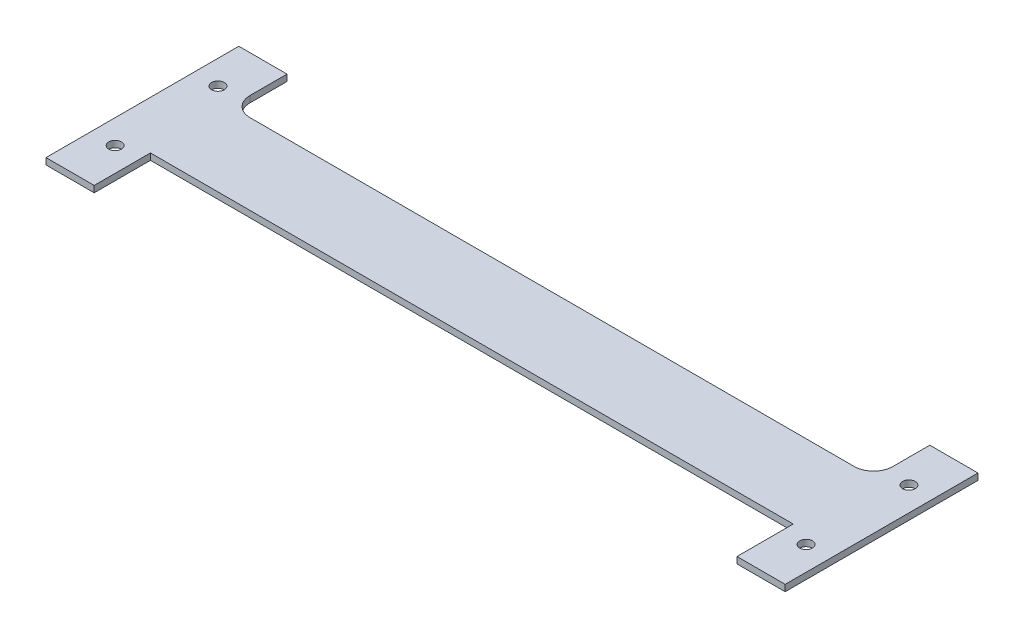
ISO-10303-21;
HEADER;
FILE_DESCRIPTION(('STEP AP214'),'2;1');
FILE_NAME('part.step','',(''),(''),'','','');
FILE_SCHEMA(('AUTOMOTIVE_DESIGN { 1 0 10303 214 1 1 1 1 }'));
ENDSEC;
DATA;
#1=APPLICATION_CONTEXT('core data for automotive mechanical design processes');
#2=APPLICATION_PROTOCOL_DEFINITION('international standard','automotive_design',2000,#1);
#3=PRODUCT_CONTEXT('',#1,'mechanical');
#4=PRODUCT('Part','Part','',(#3));
#5=PRODUCT_RELATED_PRODUCT_CATEGORY('part','',(#4));
#6=PRODUCT_DEFINITION_FORMATION('','',#4);
#7=PRODUCT_DEFINITION_CONTEXT('part definition',#1,'design');
#8=PRODUCT_DEFINITION('design','',#6,#7);
#9=PRODUCT_DEFINITION_SHAPE('','',#8);
#10=(LENGTH_UNIT() NAMED_UNIT(*) SI_UNIT(.MILLI.,.METRE.));
#11=(NAMED_UNIT(*) PLANE_ANGLE_UNIT() SI_UNIT($,.RADIAN.));
#12=(NAMED_UNIT(*) SI_UNIT($,.STERADIAN.) SOLID_ANGLE_UNIT());
#13=UNCERTAINTY_MEASURE_WITH_UNIT(LENGTH_MEASURE(1.E-05),#10,'distance_accuracy_value','');
#14=(GEOMETRIC_REPRESENTATION_CONTEXT(3) GLOBAL_UNCERTAINTY_ASSIGNED_CONTEXT((#13)) GLOBAL_UNIT_ASSIGNED_CONTEXT((#10,
#11,#12)) REPRESENTATION_CONTEXT('',''));
#15=CARTESIAN_POINT('',(0.,0.,0.));
#16=DIRECTION('',(0.,0.,1.));
#17=DIRECTION('',(1.,0.,0.));
#18=AXIS2_PLACEMENT_3D('',#15,#16,#17);
#19=CARTESIAN_POINT('',(-119.38,2.54,-23.495));
#20=DIRECTION('',(0.,1.,0.));
#21=DIRECTION('',(0.,0.,1.));
#22=AXIS2_PLACEMENT_3D('',#19,#20,#21);
#23=PLANE('',#22);
#24=CARTESIAN_POINT('',(-136.525,2.54,-20.32));
#25=DIRECTION('',(0.,1.,0.));
#26=DIRECTION('',(0.,0.,-1.));
#27=AXIS2_PLACEMENT_3D('',#24,#25,#26);
#28=CIRCLE('',#27,2.5);
#29=CARTESIAN_POINT('',(-136.525,2.54,-22.82));
#30=VERTEX_POINT('',#29);
#31=EDGE_CURVE('E316',#30,#30,#28,.T.);
#32=ORIENTED_EDGE('',*,*,#31,.F.);
#33=EDGE_LOOP('',(#32));
#34=FACE_BOUND('',#33,.T.);
#35=CARTESIAN_POINT('',(136.525,2.54,-20.32));
#36=DIRECTION('',(0.,1.,0.));
#37=DIRECTION('',(0.,0.,1.));
#38=AXIS2_PLACEMENT_3D('',#35,#36,#37);
#39=CIRCLE('',#38,2.5);
#40=CARTESIAN_POINT('',(136.525,2.54,-17.82));
#41=VERTEX_POINT('',#40);
#42=EDGE_CURVE('E169',#41,#41,#39,.T.);
#43=ORIENTED_EDGE('',*,*,#42,.F.);
#44=EDGE_LOOP('',(#43));
#45=FACE_BOUND('',#44,.T.);
#46=DIRECTION('',(0.,0.,-1.));
#47=VECTOR('',#46,1.);
#48=CARTESIAN_POINT('',(-127.,2.54,15.875));
#49=LINE('',#48,#47);
#50=CARTESIAN_POINT('',(-127.,2.54,38.1));
#51=VERTEX_POINT('',#50);
#52=CARTESIAN_POINT('',(-127.,2.54,15.875));
#53=VERTEX_POINT('',#52);
#54=EDGE_CURVE('E192',#51,#53,#49,.T.);
#55=ORIENTED_EDGE('',*,*,#54,.T.);
#56=DIRECTION('',(1.,0.,0.));
#57=VECTOR('',#56,1.);
#58=CARTESIAN_POINT('',(-127.,2.54,15.875));
#59=LINE('',#58,#57);
#60=CARTESIAN_POINT('',(127.,2.54,15.875));
#61=VERTEX_POINT('',#60);
#62=EDGE_CURVE('E110',#53,#61,#59,.T.);
#63=ORIENTED_EDGE('',*,*,#62,.T.);
#64=DIRECTION('',(0.,0.,1.));
#65=VECTOR('',#64,1.);
#66=CARTESIAN_POINT('',(127.,2.54,15.875));
#67=LINE('',#66,#65);
#68=CARTESIAN_POINT('',(127.,2.54,38.1));
#69=VERTEX_POINT('',#68);
#70=EDGE_CURVE('E225',#61,#69,#67,.T.);
#71=ORIENTED_EDGE('',*,*,#70,.T.);
#72=DIRECTION('',(1.,0.,0.));
#73=VECTOR('',#72,1.);
#74=CARTESIAN_POINT('',(127.,2.54,38.1));
#75=LINE('',#74,#73);
#76=CARTESIAN_POINT('',(146.05,2.54,38.1));
#77=VERTEX_POINT('',#76);
#78=EDGE_CURVE('E244',#69,#77,#75,.T.);
#79=ORIENTED_EDGE('',*,*,#78,.T.);
#80=DIRECTION('',(0.,0.,-1.));
#81=VECTOR('',#80,1.);
#82=CARTESIAN_POINT('',(146.05,2.54,-38.1));
#83=LINE('',#82,#81);
#84=CARTESIAN_POINT('',(146.05,2.54,-38.1));
#85=VERTEX_POINT('',#84);
#86=EDGE_CURVE('E241',#77,#85,#83,.T.);
#87=ORIENTED_EDGE('',*,*,#86,.T.);
#88=DIRECTION('',(-1.,0.,0.));
#89=VECTOR('',#88,1.);
#90=CARTESIAN_POINT('',(127.,2.54,-38.1));
#91=LINE('',#90,#89);
#92=CARTESIAN_POINT('',(127.,2.54,-38.1));
#93=VERTEX_POINT('',#92);
#94=EDGE_CURVE('E243',#85,#93,#91,.T.);
#95=ORIENTED_EDGE('',*,*,#94,.T.);
#96=DIRECTION('',(0.,0.,1.));
#97=VECTOR('',#96,1.);
#98=CARTESIAN_POINT('',(127.,2.54,-38.1));
#99=LINE('',#98,#97);
#100=CARTESIAN_POINT('',(127.,2.54,-23.495));
#101=VERTEX_POINT('',#100);
#102=EDGE_CURVE('E246',#93,#101,#99,.T.);
#103=ORIENTED_EDGE('',*,*,#102,.T.);
#104=CARTESIAN_POINT('',(119.38,2.54,-23.495));
#105=DIRECTION('',(0.,-1.,0.));
#106=DIRECTION('',(0.,0.,1.));
#107=AXIS2_PLACEMENT_3D('',#104,#105,#106);
#108=CIRCLE('',#107,7.61999999999999);
#109=CARTESIAN_POINT('',(119.38,2.54,-15.875));
#110=VERTEX_POINT('',#109);
#111=EDGE_CURVE('E252',#101,#110,#108,.T.);
#112=ORIENTED_EDGE('',*,*,#111,.T.);
#113=DIRECTION('',(-1.,0.,0.));
#114=VECTOR('',#113,1.);
#115=CARTESIAN_POINT('',(-119.38,2.54,-15.875));
#116=LINE('',#115,#114);
#117=CARTESIAN_POINT('',(-119.38,2.54,-15.875));
#118=VERTEX_POINT('',#117);
#119=EDGE_CURVE('E254',#110,#118,#116,.T.);
#120=ORIENTED_EDGE('',*,*,#119,.T.);
#121=CARTESIAN_POINT('',(-119.38,2.54,-23.495));
#122=DIRECTION('',(0.,-1.,0.));
#123=DIRECTION('',(0.,0.,1.));
#124=AXIS2_PLACEMENT_3D('',#121,#122,#123);
#125=CIRCLE('',#124,7.62);
#126=CARTESIAN_POINT('',(-127.,2.54,-23.4950000000001));
#127=VERTEX_POINT('',#126);
#128=EDGE_CURVE('E256',#118,#127,#125,.T.);
#129=ORIENTED_EDGE('',*,*,#128,.T.);
#130=DIRECTION('',(0.,0.,-1.));
#131=VECTOR('',#130,1.);
#132=CARTESIAN_POINT('',(-127.,2.54,-38.1));
#133=LINE('',#132,#131);
#134=CARTESIAN_POINT('',(-127.,2.54,-38.1));
#135=VERTEX_POINT('',#134);
#136=EDGE_CURVE('E147',#127,#135,#133,.T.);
#137=ORIENTED_EDGE('',*,*,#136,.T.);
#138=DIRECTION('',(-1.,0.,0.));
#139=VECTOR('',#138,1.);
#140=CARTESIAN_POINT('',(-127.,2.54,-38.1));
#141=LINE('',#140,#139);
#142=CARTESIAN_POINT('',(-146.05,2.54,-38.1));
#143=VERTEX_POINT('',#142);
#144=EDGE_CURVE('E141',#135,#143,#141,.T.);
#145=ORIENTED_EDGE('',*,*,#144,.T.);
#146=DIRECTION('',(0.,0.,1.));
#147=VECTOR('',#146,1.);
#148=CARTESIAN_POINT('',(-146.05,2.54,-38.1));
#149=LINE('',#148,#147);
#150=CARTESIAN_POINT('',(-146.05,2.54,38.1));
#151=VERTEX_POINT('',#150);
#152=EDGE_CURVE('E145',#143,#151,#149,.T.);
#153=ORIENTED_EDGE('',*,*,#152,.T.);
#154=DIRECTION('',(1.,0.,0.));
#155=VECTOR('',#154,1.);
#156=CARTESIAN_POINT('',(-127.,2.54,38.1));
#157=LINE('',#156,#155);
#158=EDGE_CURVE('E49',#151,#51,#157,.T.);
#159=ORIENTED_EDGE('',*,*,#158,.T.);
#160=EDGE_LOOP('',(#55,#63,#71,#79,#87,#95,#103,#112,#120,#129,#137,#145,#153,#159));
#161=FACE_BOUND('',#160,.T.);
#162=CARTESIAN_POINT('',(136.525,2.54,20.32));
#163=DIRECTION('',(0.,1.,0.));
#164=DIRECTION('',(0.,0.,1.));
#165=AXIS2_PLACEMENT_3D('',#162,#163,#164);
#166=CIRCLE('',#165,2.5);
#167=CARTESIAN_POINT('',(136.525,2.54,22.82));
#168=VERTEX_POINT('',#167);
#169=EDGE_CURVE('E322',#168,#168,#166,.T.);
#170=ORIENTED_EDGE('',*,*,#169,.F.);
#171=EDGE_LOOP('',(#170));
#172=FACE_BOUND('',#171,.T.);
#173=CARTESIAN_POINT('',(-136.525,2.54,20.32));
#174=DIRECTION('',(0.,1.,0.));
#175=DIRECTION('',(0.,0.,-1.));
#176=AXIS2_PLACEMENT_3D('',#173,#174,#175);
#177=CIRCLE('',#176,2.5);
#178=CARTESIAN_POINT('',(-136.525,2.54,17.82));
#179=VERTEX_POINT('',#178);
#180=EDGE_CURVE('E307',#179,#179,#177,.T.);
#181=ORIENTED_EDGE('',*,*,#180,.F.);
#182=EDGE_LOOP('',(#181));
#183=FACE_BOUND('',#182,.T.);
#184=ADVANCED_FACE('F32',(#34,#45,#161,#172,#183),#23,.T.);
#185=CARTESIAN_POINT('',(-119.38,0.,-23.495));
#186=DIRECTION('',(0.,1.,0.));
#187=DIRECTION('',(0.,0.,1.));
#188=AXIS2_PLACEMENT_3D('',#185,#186,#187);
#189=PLANE('',#188);
#190=DIRECTION('',(0.,0.,-1.));
#191=VECTOR('',#190,1.);
#192=CARTESIAN_POINT('',(-127.,0.,15.875));
#193=LINE('',#192,#191);
#194=CARTESIAN_POINT('',(-127.,0.,38.1));
#195=VERTEX_POINT('',#194);
#196=CARTESIAN_POINT('',(-127.,0.,15.875));
#197=VERTEX_POINT('',#196);
#198=EDGE_CURVE('E165',#195,#197,#193,.T.);
#199=ORIENTED_EDGE('',*,*,#198,.F.);
#200=DIRECTION('',(1.,0.,0.));
#201=VECTOR('',#200,1.);
#202=CARTESIAN_POINT('',(-127.,0.,38.1));
#203=LINE('',#202,#201);
#204=CARTESIAN_POINT('',(-146.05,0.,38.1));
#205=VERTEX_POINT('',#204);
#206=EDGE_CURVE('E102',#205,#195,#203,.T.);
#207=ORIENTED_EDGE('',*,*,#206,.F.);
#208=DIRECTION('',(0.,0.,1.));
#209=VECTOR('',#208,1.);
#210=CARTESIAN_POINT('',(-146.05,0.,-38.1));
#211=LINE('',#210,#209);
#212=CARTESIAN_POINT('',(-146.05,0.,-38.1));
#213=VERTEX_POINT('',#212);
#214=EDGE_CURVE('E96',#213,#205,#211,.T.);
#215=ORIENTED_EDGE('',*,*,#214,.F.);
#216=DIRECTION('',(-1.,0.,0.));
#217=VECTOR('',#216,1.);
#218=CARTESIAN_POINT('',(-127.,0.,-38.1));
#219=LINE('',#218,#217);
#220=CARTESIAN_POINT('',(-127.,0.,-38.1));
#221=VERTEX_POINT('',#220);
#222=EDGE_CURVE('E155',#221,#213,#219,.T.);
#223=ORIENTED_EDGE('',*,*,#222,.F.);
#224=DIRECTION('',(0.,0.,-1.));
#225=VECTOR('',#224,1.);
#226=CARTESIAN_POINT('',(-127.,0.,-38.1));
#227=LINE('',#226,#225);
#228=CARTESIAN_POINT('',(-127.,0.,-23.4950000000001));
#229=VERTEX_POINT('',#228);
#230=EDGE_CURVE('E187',#229,#221,#227,.T.);
#231=ORIENTED_EDGE('',*,*,#230,.F.);
#232=CARTESIAN_POINT('',(-119.38,0.,-23.495));
#233=DIRECTION('',(0.,-1.,0.));
#234=DIRECTION('',(0.,0.,1.));
#235=AXIS2_PLACEMENT_3D('',#232,#233,#234);
#236=CIRCLE('',#235,7.62);
#237=CARTESIAN_POINT('',(-119.38,0.,-15.875));
#238=VERTEX_POINT('',#237);
#239=EDGE_CURVE('E185',#238,#229,#236,.T.);
#240=ORIENTED_EDGE('',*,*,#239,.F.);
#241=DIRECTION('',(-1.,0.,0.));
#242=VECTOR('',#241,1.);
#243=CARTESIAN_POINT('',(-119.38,0.,-15.875));
#244=LINE('',#243,#242);
#245=CARTESIAN_POINT('',(119.38,0.,-15.875));
#246=VERTEX_POINT('',#245);
#247=EDGE_CURVE('E183',#246,#238,#244,.T.);
#248=ORIENTED_EDGE('',*,*,#247,.F.);
#249=CARTESIAN_POINT('',(119.38,0.,-23.495));
#250=DIRECTION('',(0.,-1.,0.));
#251=DIRECTION('',(0.,0.,1.));
#252=AXIS2_PLACEMENT_3D('',#249,#250,#251);
#253=CIRCLE('',#252,7.61999999999999);
#254=CARTESIAN_POINT('',(127.,0.,-23.495));
#255=VERTEX_POINT('',#254);
#256=EDGE_CURVE('E181',#255,#246,#253,.T.);
#257=ORIENTED_EDGE('',*,*,#256,.F.);
#258=DIRECTION('',(0.,0.,1.));
#259=VECTOR('',#258,1.);
#260=CARTESIAN_POINT('',(127.,0.,-38.1));
#261=LINE('',#260,#259);
#262=CARTESIAN_POINT('',(127.,0.,-38.1));
#263=VERTEX_POINT('',#262);
#264=EDGE_CURVE('E179',#263,#255,#261,.T.);
#265=ORIENTED_EDGE('',*,*,#264,.F.);
#266=DIRECTION('',(-1.,0.,0.));
#267=VECTOR('',#266,1.);
#268=CARTESIAN_POINT('',(127.,0.,-38.1));
#269=LINE('',#268,#267);
#270=CARTESIAN_POINT('',(146.05,0.,-38.1));
#271=VERTEX_POINT('',#270);
#272=EDGE_CURVE('E177',#271,#263,#269,.T.);
#273=ORIENTED_EDGE('',*,*,#272,.F.);
#274=DIRECTION('',(0.,0.,-1.));
#275=VECTOR('',#274,1.);
#276=CARTESIAN_POINT('',(146.05,0.,-38.1));
#277=LINE('',#276,#275);
#278=CARTESIAN_POINT('',(146.05,0.,38.1));
#279=VERTEX_POINT('',#278);
#280=EDGE_CURVE('E175',#279,#271,#277,.T.);
#281=ORIENTED_EDGE('',*,*,#280,.F.);
#282=DIRECTION('',(1.,0.,0.));
#283=VECTOR('',#282,1.);
#284=CARTESIAN_POINT('',(127.,0.,38.1));
#285=LINE('',#284,#283);
#286=CARTESIAN_POINT('',(127.,0.,38.1));
#287=VERTEX_POINT('',#286);
#288=EDGE_CURVE('E173',#287,#279,#285,.T.);
#289=ORIENTED_EDGE('',*,*,#288,.F.);
#290=DIRECTION('',(0.,0.,1.));
#291=VECTOR('',#290,1.);
#292=CARTESIAN_POINT('',(127.,0.,15.875));
#293=LINE('',#292,#291);
#294=CARTESIAN_POINT('',(127.,0.,15.875));
#295=VERTEX_POINT('',#294);
#296=EDGE_CURVE('E171',#295,#287,#293,.T.);
#297=ORIENTED_EDGE('',*,*,#296,.F.);
#298=DIRECTION('',(1.,0.,0.));
#299=VECTOR('',#298,1.);
#300=CARTESIAN_POINT('',(-127.,0.,15.875));
#301=LINE('',#300,#299);
#302=EDGE_CURVE('E168',#197,#295,#301,.T.);
#303=ORIENTED_EDGE('',*,*,#302,.F.);
#304=EDGE_LOOP('',(#199,#207,#215,#223,#231,#240,#248,#257,#265,#273,#281,#289,#297,#303));
#305=FACE_BOUND('',#304,.T.);
#306=CARTESIAN_POINT('',(136.525,0.,-20.32));
#307=DIRECTION('',(0.,1.,0.));
#308=DIRECTION('',(0.,0.,1.));
#309=AXIS2_PLACEMENT_3D('',#306,#307,#308);
#310=CIRCLE('',#309,2.5);
#311=CARTESIAN_POINT('',(136.525,0.,-17.82));
#312=VERTEX_POINT('',#311);
#313=EDGE_CURVE('E325',#312,#312,#310,.T.);
#314=ORIENTED_EDGE('',*,*,#313,.T.);
#315=EDGE_LOOP('',(#314));
#316=FACE_BOUND('',#315,.T.);
#317=CARTESIAN_POINT('',(136.525,0.,20.32));
#318=DIRECTION('',(0.,1.,0.));
#319=DIRECTION('',(0.,0.,1.));
#320=AXIS2_PLACEMENT_3D('',#317,#318,#319);
#321=CIRCLE('',#320,2.5);
#322=CARTESIAN_POINT('',(136.525,0.,22.82));
#323=VERTEX_POINT('',#322);
#324=EDGE_CURVE('E319',#323,#323,#321,.T.);
#325=ORIENTED_EDGE('',*,*,#324,.T.);
#326=EDGE_LOOP('',(#325));
#327=FACE_BOUND('',#326,.T.);
#328=CARTESIAN_POINT('',(-136.525,0.,-20.32));
#329=DIRECTION('',(0.,1.,0.));
#330=DIRECTION('',(0.,0.,-1.));
#331=AXIS2_PLACEMENT_3D('',#328,#329,#330);
#332=CIRCLE('',#331,2.5);
#333=CARTESIAN_POINT('',(-136.525,0.,-22.82));
#334=VERTEX_POINT('',#333);
#335=EDGE_CURVE('E313',#334,#334,#332,.T.);
#336=ORIENTED_EDGE('',*,*,#335,.T.);
#337=EDGE_LOOP('',(#336));
#338=FACE_BOUND('',#337,.T.);
#339=CARTESIAN_POINT('',(-136.525,0.,20.32));
#340=DIRECTION('',(0.,1.,0.));
#341=DIRECTION('',(0.,0.,-1.));
#342=AXIS2_PLACEMENT_3D('',#339,#340,#341);
#343=CIRCLE('',#342,2.5);
#344=CARTESIAN_POINT('',(-136.525,0.,17.82));
#345=VERTEX_POINT('',#344);
#346=EDGE_CURVE('E310',#345,#345,#343,.T.);
#347=ORIENTED_EDGE('',*,*,#346,.T.);
#348=EDGE_LOOP('',(#347));
#349=FACE_BOUND('',#348,.T.);
#350=ADVANCED_FACE('F229',(#305,#316,#327,#338,#349),#189,.F.);
#351=CARTESIAN_POINT('',(-127.,2.54,15.875));
#352=DIRECTION('',(-1.,0.,0.));
#353=DIRECTION('',(0.,0.,1.));
#354=AXIS2_PLACEMENT_3D('',#351,#352,#353);
#355=PLANE('',#354);
#356=ORIENTED_EDGE('',*,*,#198,.T.);
#357=DIRECTION('',(0.,-1.,0.));
#358=VECTOR('',#357,1.);
#359=CARTESIAN_POINT('',(-127.,2.54,15.875));
#360=LINE('',#359,#358);
#361=EDGE_CURVE('E11',#53,#197,#360,.T.);
#362=ORIENTED_EDGE('',*,*,#361,.F.);
#363=ORIENTED_EDGE('',*,*,#54,.F.);
#364=DIRECTION('',(0.,-1.,0.));
#365=VECTOR('',#364,1.);
#366=CARTESIAN_POINT('',(-127.,2.54,38.1));
#367=LINE('',#366,#365);
#368=EDGE_CURVE('E161',#51,#195,#367,.T.);
#369=ORIENTED_EDGE('',*,*,#368,.T.);
#370=EDGE_LOOP('',(#356,#362,#363,#369));
#371=FACE_BOUND('',#370,.T.);
#372=ADVANCED_FACE('F34',(#371),#355,.F.);
#373=CARTESIAN_POINT('',(-127.,2.54,15.875));
#374=DIRECTION('',(0.,0.,-1.));
#375=DIRECTION('',(-1.,0.,0.));
#376=AXIS2_PLACEMENT_3D('',#373,#374,#375);
#377=PLANE('',#376);
#378=ORIENTED_EDGE('',*,*,#302,.T.);
#379=DIRECTION('',(0.,-1.,0.));
#380=VECTOR('',#379,1.);
#381=CARTESIAN_POINT('',(127.,2.54,15.875));
#382=LINE('',#381,#380);
#383=EDGE_CURVE('E41',#61,#295,#382,.T.);
#384=ORIENTED_EDGE('',*,*,#383,.F.);
#385=ORIENTED_EDGE('',*,*,#62,.F.);
#386=ORIENTED_EDGE('',*,*,#361,.T.);
#387=EDGE_LOOP('',(#378,#384,#385,#386));
#388=FACE_BOUND('',#387,.T.);
#389=ADVANCED_FACE('F455',(#388),#377,.F.);
#390=CARTESIAN_POINT('',(127.,2.54,15.875));
#391=DIRECTION('',(1.,0.,0.));
#392=DIRECTION('',(0.,0.,-1.));
#393=AXIS2_PLACEMENT_3D('',#390,#391,#392);
#394=PLANE('',#393);
#395=ORIENTED_EDGE('',*,*,#296,.T.);
#396=DIRECTION('',(0.,-1.,0.));
#397=VECTOR('',#396,1.);
#398=CARTESIAN_POINT('',(127.,2.54,38.1));
#399=LINE('',#398,#397);
#400=EDGE_CURVE('E217',#69,#287,#399,.T.);
#401=ORIENTED_EDGE('',*,*,#400,.F.);
#402=ORIENTED_EDGE('',*,*,#70,.F.);
#403=ORIENTED_EDGE('',*,*,#383,.T.);
#404=EDGE_LOOP('',(#395,#401,#402,#403));
#405=FACE_BOUND('',#404,.T.);
#406=ADVANCED_FACE('F223',(#405),#394,.F.);
#407=CARTESIAN_POINT('',(127.,2.54,38.1));
#408=DIRECTION('',(0.,0.,-1.));
#409=DIRECTION('',(-1.,0.,0.));
#410=AXIS2_PLACEMENT_3D('',#407,#408,#409);
#411=PLANE('',#410);
#412=ORIENTED_EDGE('',*,*,#288,.T.);
#413=DIRECTION('',(0.,-1.,0.));
#414=VECTOR('',#413,1.);
#415=CARTESIAN_POINT('',(146.05,2.54,38.1));
#416=LINE('',#415,#414);
#417=EDGE_CURVE('E214',#77,#279,#416,.T.);
#418=ORIENTED_EDGE('',*,*,#417,.F.);
#419=ORIENTED_EDGE('',*,*,#78,.F.);
#420=ORIENTED_EDGE('',*,*,#400,.T.);
#421=EDGE_LOOP('',(#412,#418,#419,#420));
#422=FACE_BOUND('',#421,.T.);
#423=ADVANCED_FACE('F235',(#422),#411,.F.);
#424=CARTESIAN_POINT('',(146.05,2.54,-38.1));
#425=DIRECTION('',(-1.,0.,0.));
#426=DIRECTION('',(0.,0.,1.));
#427=AXIS2_PLACEMENT_3D('',#424,#425,#426);
#428=PLANE('',#427);
#429=ORIENTED_EDGE('',*,*,#280,.T.);
#430=DIRECTION('',(0.,-1.,0.));
#431=VECTOR('',#430,1.);
#432=CARTESIAN_POINT('',(146.05,2.54,-38.1));
#433=LINE('',#432,#431);
#434=EDGE_CURVE('E211',#85,#271,#433,.T.);
#435=ORIENTED_EDGE('',*,*,#434,.F.);
#436=ORIENTED_EDGE('',*,*,#86,.F.);
#437=ORIENTED_EDGE('',*,*,#417,.T.);
#438=EDGE_LOOP('',(#429,#435,#436,#437));
#439=FACE_BOUND('',#438,.T.);
#440=ADVANCED_FACE('F239',(#439),#428,.F.);
#441=CARTESIAN_POINT('',(127.,2.54,-38.1));
#442=DIRECTION('',(0.,0.,1.));
#443=DIRECTION('',(1.,0.,0.));
#444=AXIS2_PLACEMENT_3D('',#441,#442,#443);
#445=PLANE('',#444);
#446=ORIENTED_EDGE('',*,*,#272,.T.);
#447=DIRECTION('',(0.,-1.,0.));
#448=VECTOR('',#447,1.);
#449=CARTESIAN_POINT('',(127.,2.54,-38.1));
#450=LINE('',#449,#448);
#451=EDGE_CURVE('E208',#93,#263,#450,.T.);
#452=ORIENTED_EDGE('',*,*,#451,.F.);
#453=ORIENTED_EDGE('',*,*,#94,.F.);
#454=ORIENTED_EDGE('',*,*,#434,.T.);
#455=EDGE_LOOP('',(#446,#452,#453,#454));
#456=FACE_BOUND('',#455,.T.);
#457=ADVANCED_FACE('F420',(#456),#445,.F.);
#458=CARTESIAN_POINT('',(127.,2.54,-38.1));
#459=DIRECTION('',(1.,0.,0.));
#460=DIRECTION('',(0.,0.,-1.));
#461=AXIS2_PLACEMENT_3D('',#458,#459,#460);
#462=PLANE('',#461);
#463=ORIENTED_EDGE('',*,*,#264,.T.);
#464=DIRECTION('',(0.,-1.,0.));
#465=VECTOR('',#464,1.);
#466=CARTESIAN_POINT('',(127.,2.54,-23.495));
#467=LINE('',#466,#465);
#468=EDGE_CURVE('E205',#101,#255,#467,.T.);
#469=ORIENTED_EDGE('',*,*,#468,.F.);
#470=ORIENTED_EDGE('',*,*,#102,.F.);
#471=ORIENTED_EDGE('',*,*,#451,.T.);
#472=EDGE_LOOP('',(#463,#469,#470,#471));
#473=FACE_BOUND('',#472,.T.);
#474=ADVANCED_FACE('F410',(#473),#462,.F.);
#475=CARTESIAN_POINT('',(119.38,2.54,-23.495));
#476=DIRECTION('',(0.,-1.,0.));
#477=DIRECTION('',(0.,0.,-1.));
#478=AXIS2_PLACEMENT_3D('',#475,#476,#477);
#479=CYLINDRICAL_SURFACE('',#478,7.61999999999999);
#480=ORIENTED_EDGE('',*,*,#256,.T.);
#481=DIRECTION('',(0.,-1.,0.));
#482=VECTOR('',#481,1.);
#483=CARTESIAN_POINT('',(119.38,2.54,-15.875));
#484=LINE('',#483,#482);
#485=EDGE_CURVE('E202',#110,#246,#484,.T.);
#486=ORIENTED_EDGE('',*,*,#485,.F.);
#487=ORIENTED_EDGE('',*,*,#111,.F.);
#488=ORIENTED_EDGE('',*,*,#468,.T.);
#489=EDGE_LOOP('',(#480,#486,#487,#488));
#490=FACE_BOUND('',#489,.T.);
#491=ADVANCED_FACE('F400',(#490),#479,.F.);
#492=CARTESIAN_POINT('',(-119.38,2.54,-15.875));
#493=DIRECTION('',(0.,0.,1.));
#494=DIRECTION('',(1.,0.,0.));
#495=AXIS2_PLACEMENT_3D('',#492,#493,#494);
#496=PLANE('',#495);
#497=ORIENTED_EDGE('',*,*,#247,.T.);
#498=DIRECTION('',(0.,-1.,0.));
#499=VECTOR('',#498,1.);
#500=CARTESIAN_POINT('',(-119.38,2.54,-15.875));
#501=LINE('',#500,#499);
#502=EDGE_CURVE('E199',#118,#238,#501,.T.);
#503=ORIENTED_EDGE('',*,*,#502,.F.);
#504=ORIENTED_EDGE('',*,*,#119,.F.);
#505=ORIENTED_EDGE('',*,*,#485,.T.);
#506=EDGE_LOOP('',(#497,#503,#504,#505));
#507=FACE_BOUND('',#506,.T.);
#508=ADVANCED_FACE('F391',(#507),#496,.F.);
#509=CARTESIAN_POINT('',(-119.38,2.54,-23.495));
#510=DIRECTION('',(0.,-1.,0.));
#511=DIRECTION('',(0.,0.,-1.));
#512=AXIS2_PLACEMENT_3D('',#509,#510,#511);
#513=CYLINDRICAL_SURFACE('',#512,7.62);
#514=ORIENTED_EDGE('',*,*,#239,.T.);
#515=DIRECTION('',(0.,-1.,0.));
#516=VECTOR('',#515,1.);
#517=CARTESIAN_POINT('',(-127.,2.54,-23.4950000000001));
#518=LINE('',#517,#516);
#519=EDGE_CURVE('E196',#127,#229,#518,.T.);
#520=ORIENTED_EDGE('',*,*,#519,.F.);
#521=ORIENTED_EDGE('',*,*,#128,.F.);
#522=ORIENTED_EDGE('',*,*,#502,.T.);
#523=EDGE_LOOP('',(#514,#520,#521,#522));
#524=FACE_BOUND('',#523,.T.);
#525=ADVANCED_FACE('F262',(#524),#513,.F.);
#526=CARTESIAN_POINT('',(-127.,2.54,-38.1));
#527=DIRECTION('',(-1.,0.,0.));
#528=DIRECTION('',(0.,0.,1.));
#529=AXIS2_PLACEMENT_3D('',#526,#527,#528);
#530=PLANE('',#529);
#531=ORIENTED_EDGE('',*,*,#230,.T.);
#532=DIRECTION('',(0.,-1.,0.));
#533=VECTOR('',#532,1.);
#534=CARTESIAN_POINT('',(-127.,2.54,-38.1));
#535=LINE('',#534,#533);
#536=EDGE_CURVE('E156',#135,#221,#535,.T.);
#537=ORIENTED_EDGE('',*,*,#536,.F.);
#538=ORIENTED_EDGE('',*,*,#136,.F.);
#539=ORIENTED_EDGE('',*,*,#519,.T.);
#540=EDGE_LOOP('',(#531,#537,#538,#539));
#541=FACE_BOUND('',#540,.T.);
#542=ADVANCED_FACE('F266',(#541),#530,.F.);
#543=CARTESIAN_POINT('',(-127.,2.54,-38.1));
#544=DIRECTION('',(0.,0.,1.));
#545=DIRECTION('',(1.,0.,0.));
#546=AXIS2_PLACEMENT_3D('',#543,#544,#545);
#547=PLANE('',#546);
#548=ORIENTED_EDGE('',*,*,#222,.T.);
#549=DIRECTION('',(0.,-1.,0.));
#550=VECTOR('',#549,1.);
#551=CARTESIAN_POINT('',(-146.05,2.54,-38.1));
#552=LINE('',#551,#550);
#553=EDGE_CURVE('E152',#143,#213,#552,.T.);
#554=ORIENTED_EDGE('',*,*,#553,.F.);
#555=ORIENTED_EDGE('',*,*,#144,.F.);
#556=ORIENTED_EDGE('',*,*,#536,.T.);
#557=EDGE_LOOP('',(#548,#554,#555,#556));
#558=FACE_BOUND('',#557,.T.);
#559=ADVANCED_FACE('F153',(#558),#547,.F.);
#560=CARTESIAN_POINT('',(-146.05,2.54,-38.1));
#561=DIRECTION('',(1.,0.,0.));
#562=DIRECTION('',(0.,0.,-1.));
#563=AXIS2_PLACEMENT_3D('',#560,#561,#562);
#564=PLANE('',#563);
#565=ORIENTED_EDGE('',*,*,#214,.T.);
#566=DIRECTION('',(0.,-1.,0.));
#567=VECTOR('',#566,1.);
#568=CARTESIAN_POINT('',(-146.05,2.54,38.1));
#569=LINE('',#568,#567);
#570=EDGE_CURVE('E157',#151,#205,#569,.T.);
#571=ORIENTED_EDGE('',*,*,#570,.F.);
#572=ORIENTED_EDGE('',*,*,#152,.F.);
#573=ORIENTED_EDGE('',*,*,#553,.T.);
#574=EDGE_LOOP('',(#565,#571,#572,#573));
#575=FACE_BOUND('',#574,.T.);
#576=ADVANCED_FACE('F159',(#575),#564,.F.);
#577=CARTESIAN_POINT('',(-127.,2.54,38.1));
#578=DIRECTION('',(0.,0.,-1.));
#579=DIRECTION('',(-1.,0.,0.));
#580=AXIS2_PLACEMENT_3D('',#577,#578,#579);
#581=PLANE('',#580);
#582=ORIENTED_EDGE('',*,*,#206,.T.);
#583=ORIENTED_EDGE('',*,*,#368,.F.);
#584=ORIENTED_EDGE('',*,*,#158,.F.);
#585=ORIENTED_EDGE('',*,*,#570,.T.);
#586=EDGE_LOOP('',(#582,#583,#584,#585));
#587=FACE_BOUND('',#586,.T.);
#588=ADVANCED_FACE('F270',(#587),#581,.F.);
#589=CARTESIAN_POINT('',(136.525,2.54,-20.32));
#590=DIRECTION('',(0.,-1.,0.));
#591=DIRECTION('',(0.,0.,-1.));
#592=AXIS2_PLACEMENT_3D('',#589,#590,#591);
#593=CYLINDRICAL_SURFACE('',#592,2.5);
#594=ORIENTED_EDGE('',*,*,#42,.T.);
#595=EDGE_LOOP('',(#594));
#596=FACE_BOUND('',#595,.T.);
#597=ORIENTED_EDGE('',*,*,#313,.F.);
#598=EDGE_LOOP('',(#597));
#599=FACE_BOUND('',#598,.T.);
#600=ADVANCED_FACE('F272',(#596,#599),#593,.F.);
#601=CARTESIAN_POINT('',(136.525,2.54,20.32));
#602=DIRECTION('',(0.,-1.,0.));
#603=DIRECTION('',(0.,0.,-1.));
#604=AXIS2_PLACEMENT_3D('',#601,#602,#603);
#605=CYLINDRICAL_SURFACE('',#604,2.5);
#606=ORIENTED_EDGE('',*,*,#169,.T.);
#607=EDGE_LOOP('',(#606));
#608=FACE_BOUND('',#607,.T.);
#609=ORIENTED_EDGE('',*,*,#324,.F.);
#610=EDGE_LOOP('',(#609));
#611=FACE_BOUND('',#610,.T.);
#612=ADVANCED_FACE('F278',(#608,#611),#605,.F.);
#613=CARTESIAN_POINT('',(-136.525,2.54,-20.32));
#614=DIRECTION('',(0.,-1.,0.));
#615=DIRECTION('',(0.,0.,-1.));
#616=AXIS2_PLACEMENT_3D('',#613,#614,#615);
#617=CYLINDRICAL_SURFACE('',#616,2.5);
#618=ORIENTED_EDGE('',*,*,#31,.T.);
#619=EDGE_LOOP('',(#618));
#620=FACE_BOUND('',#619,.T.);
#621=ORIENTED_EDGE('',*,*,#335,.F.);
#622=EDGE_LOOP('',(#621));
#623=FACE_BOUND('',#622,.T.);
#624=ADVANCED_FACE('F294',(#620,#623),#617,.F.);
#625=CARTESIAN_POINT('',(-136.525,2.54,20.32));
#626=DIRECTION('',(0.,-1.,0.));
#627=DIRECTION('',(0.,0.,-1.));
#628=AXIS2_PLACEMENT_3D('',#625,#626,#627);
#629=CYLINDRICAL_SURFACE('',#628,2.5);
#630=ORIENTED_EDGE('',*,*,#180,.T.);
#631=EDGE_LOOP('',(#630));
#632=FACE_BOUND('',#631,.T.);
#633=ORIENTED_EDGE('',*,*,#346,.F.);
#634=EDGE_LOOP('',(#633));
#635=FACE_BOUND('',#634,.T.);
#636=ADVANCED_FACE('F298',(#632,#635),#629,.F.);
#637=CLOSED_SHELL('',(#184,#350,#372,#389,#406,#423,#440,#457,#474,#491,#508,#525,#542,#559,
#576,#588,#600,#612,#624,#636));
#638=MANIFOLD_SOLID_BREP('B2',#637);
#639=ADVANCED_BREP_SHAPE_REPRESENTATION('',(#18,#638),#14);
#640=SHAPE_DEFINITION_REPRESENTATION(#9,#639);
ENDSEC;
END-ISO-10303-21;
